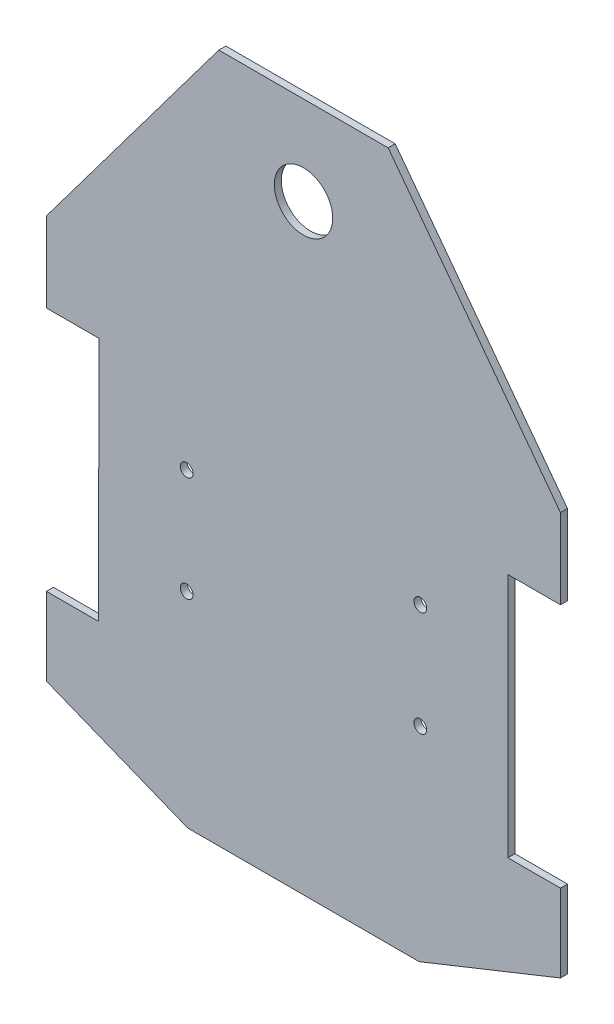
ISO-10303-21;
HEADER;
FILE_DESCRIPTION(('STEP AP214'),'2;1');
FILE_NAME('part.step','',(''),(''),'','','');
FILE_SCHEMA(('AUTOMOTIVE_DESIGN { 1 0 10303 214 1 1 1 1 }'));
ENDSEC;
DATA;
#1=APPLICATION_CONTEXT('core data for automotive mechanical design processes');
#2=APPLICATION_PROTOCOL_DEFINITION('international standard','automotive_design',2000,#1);
#3=PRODUCT_CONTEXT('',#1,'mechanical');
#4=PRODUCT('Part','Part','',(#3));
#5=PRODUCT_RELATED_PRODUCT_CATEGORY('part','',(#4));
#6=PRODUCT_DEFINITION_FORMATION('','',#4);
#7=PRODUCT_DEFINITION_CONTEXT('part definition',#1,'design');
#8=PRODUCT_DEFINITION('design','',#6,#7);
#9=PRODUCT_DEFINITION_SHAPE('','',#8);
#10=(LENGTH_UNIT() NAMED_UNIT(*) SI_UNIT(.MILLI.,.METRE.));
#11=(NAMED_UNIT(*) PLANE_ANGLE_UNIT() SI_UNIT($,.RADIAN.));
#12=(NAMED_UNIT(*) SI_UNIT($,.STERADIAN.) SOLID_ANGLE_UNIT());
#13=UNCERTAINTY_MEASURE_WITH_UNIT(LENGTH_MEASURE(1.E-05),#10,'distance_accuracy_value','');
#14=(GEOMETRIC_REPRESENTATION_CONTEXT(3) GLOBAL_UNCERTAINTY_ASSIGNED_CONTEXT((#13)) GLOBAL_UNIT_ASSIGNED_CONTEXT((#10,
#11,#12)) REPRESENTATION_CONTEXT('',''));
#15=CARTESIAN_POINT('',(0.,0.,0.));
#16=DIRECTION('',(0.,0.,1.));
#17=DIRECTION('',(1.,0.,0.));
#18=AXIS2_PLACEMENT_3D('',#15,#16,#17);
#19=CARTESIAN_POINT('',(0.,0.,1.2));
#20=DIRECTION('',(0.,0.,-1.));
#21=DIRECTION('',(-1.,0.,0.));
#22=AXIS2_PLACEMENT_3D('',#19,#20,#21);
#23=PLANE('',#22);
#24=CARTESIAN_POINT('',(0.,43.8089115427591,1.2));
#25=DIRECTION('',(0.,0.,1.));
#26=DIRECTION('',(1.,0.,0.));
#27=AXIS2_PLACEMENT_3D('',#24,#25,#26);
#28=CIRCLE('',#27,5.);
#29=CARTESIAN_POINT('',(5.,43.8089115427591,1.2));
#30=VERTEX_POINT('',#29);
#31=EDGE_CURVE('E344',#30,#30,#28,.T.);
#32=ORIENTED_EDGE('',*,*,#31,.F.);
#33=EDGE_LOOP('',(#32));
#34=FACE_BOUND('',#33,.T.);
#35=DIRECTION('',(1.,0.,0.));
#36=VECTOR('',#35,1.);
#37=CARTESIAN_POINT('',(19.8074175964328,-59.,1.2));
#38=LINE('',#37,#36);
#39=CARTESIAN_POINT('',(-19.8074175964328,-59.,1.2));
#40=VERTEX_POINT('',#39);
#41=CARTESIAN_POINT('',(19.8074175964328,-59.,1.2));
#42=VERTEX_POINT('',#41);
#43=EDGE_CURVE('E213',#40,#42,#38,.T.);
#44=ORIENTED_EDGE('',*,*,#43,.T.);
#45=DIRECTION('',(0.92847669088526,0.371390676354104,0.));
#46=VECTOR('',#45,1.);
#47=CARTESIAN_POINT('',(44.,-49.3229670385731,1.2));
#48=LINE('',#47,#46);
#49=CARTESIAN_POINT('',(44.,-49.3229670385731,1.2));
#50=VERTEX_POINT('',#49);
#51=EDGE_CURVE('E121',#42,#50,#48,.T.);
#52=ORIENTED_EDGE('',*,*,#51,.T.);
#53=DIRECTION('',(0.,1.,0.));
#54=VECTOR('',#53,1.);
#55=CARTESIAN_POINT('',(44.,-36.,1.2));
#56=LINE('',#55,#54);
#57=CARTESIAN_POINT('',(44.,-36.,1.2));
#58=VERTEX_POINT('',#57);
#59=EDGE_CURVE('E252',#50,#58,#56,.T.);
#60=ORIENTED_EDGE('',*,*,#59,.T.);
#61=DIRECTION('',(-1.,0.,0.));
#62=VECTOR('',#61,1.);
#63=CARTESIAN_POINT('',(35.,-36.,1.2));
#64=LINE('',#63,#62);
#65=CARTESIAN_POINT('',(35.,-36.,1.2));
#66=VERTEX_POINT('',#65);
#67=EDGE_CURVE('E271',#58,#66,#64,.T.);
#68=ORIENTED_EDGE('',*,*,#67,.T.);
#69=DIRECTION('',(0.,1.,0.));
#70=VECTOR('',#69,1.);
#71=CARTESIAN_POINT('',(35.,6.,1.2));
#72=LINE('',#71,#70);
#73=CARTESIAN_POINT('',(35.,6.,1.2));
#74=VERTEX_POINT('',#73);
#75=EDGE_CURVE('E268',#66,#74,#72,.T.);
#76=ORIENTED_EDGE('',*,*,#75,.T.);
#77=DIRECTION('',(1.,0.,0.));
#78=VECTOR('',#77,1.);
#79=CARTESIAN_POINT('',(44.,6.,1.2));
#80=LINE('',#79,#78);
#81=CARTESIAN_POINT('',(44.,6.,1.2));
#82=VERTEX_POINT('',#81);
#83=EDGE_CURVE('E270',#74,#82,#80,.T.);
#84=ORIENTED_EDGE('',*,*,#83,.T.);
#85=DIRECTION('',(0.,1.,0.));
#86=VECTOR('',#85,1.);
#87=CARTESIAN_POINT('',(44.,19.6666666666667,1.2));
#88=LINE('',#87,#86);
#89=CARTESIAN_POINT('',(44.,19.6666666666667,1.2));
#90=VERTEX_POINT('',#89);
#91=EDGE_CURVE('E273',#82,#90,#88,.T.);
#92=ORIENTED_EDGE('',*,*,#91,.T.);
#93=DIRECTION('',(-0.6,0.8,0.));
#94=VECTOR('',#93,1.);
#95=CARTESIAN_POINT('',(14.5,59.,1.2));
#96=LINE('',#95,#94);
#97=CARTESIAN_POINT('',(14.5,59.,1.2));
#98=VERTEX_POINT('',#97);
#99=EDGE_CURVE('E279',#90,#98,#96,.T.);
#100=ORIENTED_EDGE('',*,*,#99,.T.);
#101=DIRECTION('',(-1.,0.,0.));
#102=VECTOR('',#101,1.);
#103=CARTESIAN_POINT('',(-14.5,59.,1.2));
#104=LINE('',#103,#102);
#105=CARTESIAN_POINT('',(-14.5,59.,1.2));
#106=VERTEX_POINT('',#105);
#107=EDGE_CURVE('E281',#98,#106,#104,.T.);
#108=ORIENTED_EDGE('',*,*,#107,.T.);
#109=DIRECTION('',(-0.6,-0.8,0.));
#110=VECTOR('',#109,1.);
#111=CARTESIAN_POINT('',(-44.,19.6666666666667,1.2));
#112=LINE('',#111,#110);
#113=CARTESIAN_POINT('',(-44.,19.6666666666667,1.2));
#114=VERTEX_POINT('',#113);
#115=EDGE_CURVE('E283',#106,#114,#112,.T.);
#116=ORIENTED_EDGE('',*,*,#115,.T.);
#117=DIRECTION('',(0.,-1.,0.));
#118=VECTOR('',#117,1.);
#119=CARTESIAN_POINT('',(-44.,6.,1.2));
#120=LINE('',#119,#118);
#121=CARTESIAN_POINT('',(-44.,6.,1.2));
#122=VERTEX_POINT('',#121);
#123=EDGE_CURVE('E285',#114,#122,#120,.T.);
#124=ORIENTED_EDGE('',*,*,#123,.T.);
#125=DIRECTION('',(1.,0.,0.));
#126=VECTOR('',#125,1.);
#127=CARTESIAN_POINT('',(-35.,6.,1.2));
#128=LINE('',#127,#126);
#129=CARTESIAN_POINT('',(-35.,6.,1.2));
#130=VERTEX_POINT('',#129);
#131=EDGE_CURVE('E287',#122,#130,#128,.T.);
#132=ORIENTED_EDGE('',*,*,#131,.T.);
#133=DIRECTION('',(-0.00261649095802277,-0.999996576981675,0.));
#134=VECTOR('',#133,1.);
#135=CARTESIAN_POINT('',(-35.1098929964027,-36.,1.2));
#136=LINE('',#135,#134);
#137=CARTESIAN_POINT('',(-35.1098929964027,-36.,1.2));
#138=VERTEX_POINT('',#137);
#139=EDGE_CURVE('E164',#130,#138,#136,.T.);
#140=ORIENTED_EDGE('',*,*,#139,.T.);
#141=DIRECTION('',(-1.,0.,0.));
#142=VECTOR('',#141,1.);
#143=CARTESIAN_POINT('',(-44.,-36.,1.2));
#144=LINE('',#143,#142);
#145=CARTESIAN_POINT('',(-44.,-36.,1.2));
#146=VERTEX_POINT('',#145);
#147=EDGE_CURVE('E158',#138,#146,#144,.T.);
#148=ORIENTED_EDGE('',*,*,#147,.T.);
#149=DIRECTION('',(0.,-1.,0.));
#150=VECTOR('',#149,1.);
#151=CARTESIAN_POINT('',(-44.,-49.3229670385731,1.2));
#152=LINE('',#151,#150);
#153=CARTESIAN_POINT('',(-44.,-49.3229670385731,1.2));
#154=VERTEX_POINT('',#153);
#155=EDGE_CURVE('E162',#146,#154,#152,.T.);
#156=ORIENTED_EDGE('',*,*,#155,.T.);
#157=DIRECTION('',(0.92847669088526,-0.371390676354104,0.));
#158=VECTOR('',#157,1.);
#159=CARTESIAN_POINT('',(-19.8074175964328,-59.,1.2));
#160=LINE('',#159,#158);
#161=EDGE_CURVE('E54',#154,#40,#160,.T.);
#162=ORIENTED_EDGE('',*,*,#161,.T.);
#163=EDGE_LOOP('',(#44,#52,#60,#68,#76,#84,#92,#100,#108,#116,#124,#132,#140,#148,#156,#162));
#164=FACE_BOUND('',#163,.T.);
#165=CARTESIAN_POINT('',(-20.,-6.00000000000009,1.2));
#166=DIRECTION('',(0.,0.,1.));
#167=DIRECTION('',(1.,0.,0.));
#168=AXIS2_PLACEMENT_3D('',#165,#166,#167);
#169=CIRCLE('',#168,1.1);
#170=CARTESIAN_POINT('',(-18.9,-6.00000000000009,1.2));
#171=VERTEX_POINT('',#170);
#172=EDGE_CURVE('E186',#171,#171,#169,.T.);
#173=ORIENTED_EDGE('',*,*,#172,.F.);
#174=EDGE_LOOP('',(#173));
#175=FACE_BOUND('',#174,.T.);
#176=CARTESIAN_POINT('',(-20.,-24.0000000000001,1.2));
#177=DIRECTION('',(0.,0.,1.));
#178=DIRECTION('',(1.,0.,0.));
#179=AXIS2_PLACEMENT_3D('',#176,#177,#178);
#180=CIRCLE('',#179,1.1);
#181=CARTESIAN_POINT('',(-18.9,-24.0000000000001,1.2));
#182=VERTEX_POINT('',#181);
#183=EDGE_CURVE('E361',#182,#182,#180,.T.);
#184=ORIENTED_EDGE('',*,*,#183,.F.);
#185=EDGE_LOOP('',(#184));
#186=FACE_BOUND('',#185,.T.);
#187=CARTESIAN_POINT('',(20.,-6.00000000000009,1.2));
#188=DIRECTION('',(0.,0.,1.));
#189=DIRECTION('',(1.,0.,0.));
#190=AXIS2_PLACEMENT_3D('',#187,#188,#189);
#191=CIRCLE('',#190,1.1);
#192=CARTESIAN_POINT('',(21.1,-6.00000000000009,1.2));
#193=VERTEX_POINT('',#192);
#194=EDGE_CURVE('E355',#193,#193,#191,.T.);
#195=ORIENTED_EDGE('',*,*,#194,.F.);
#196=EDGE_LOOP('',(#195));
#197=FACE_BOUND('',#196,.T.);
#198=CARTESIAN_POINT('',(20.,-24.0000000000001,1.2));
#199=DIRECTION('',(0.,0.,1.));
#200=DIRECTION('',(1.,0.,0.));
#201=AXIS2_PLACEMENT_3D('',#198,#199,#200);
#202=CIRCLE('',#201,1.1);
#203=CARTESIAN_POINT('',(21.1,-24.0000000000001,1.2));
#204=VERTEX_POINT('',#203);
#205=EDGE_CURVE('E349',#204,#204,#202,.T.);
#206=ORIENTED_EDGE('',*,*,#205,.F.);
#207=EDGE_LOOP('',(#206));
#208=FACE_BOUND('',#207,.T.);
#209=ADVANCED_FACE('F37',(#34,#164,#175,#186,#197,#208),#23,.F.);
#210=CARTESIAN_POINT('',(0.,0.,0.));
#211=DIRECTION('',(0.,0.,-1.));
#212=DIRECTION('',(-1.,0.,0.));
#213=AXIS2_PLACEMENT_3D('',#210,#211,#212);
#214=PLANE('',#213);
#215=CARTESIAN_POINT('',(0.,43.8089115427591,0.));
#216=DIRECTION('',(0.,0.,1.));
#217=DIRECTION('',(1.,0.,0.));
#218=AXIS2_PLACEMENT_3D('',#215,#216,#217);
#219=CIRCLE('',#218,5.);
#220=CARTESIAN_POINT('',(5.,43.8089115427591,0.));
#221=VERTEX_POINT('',#220);
#222=EDGE_CURVE('E342',#221,#221,#219,.T.);
#223=ORIENTED_EDGE('',*,*,#222,.T.);
#224=EDGE_LOOP('',(#223));
#225=FACE_BOUND('',#224,.T.);
#226=CARTESIAN_POINT('',(20.,-6.00000000000009,0.));
#227=DIRECTION('',(0.,0.,1.));
#228=DIRECTION('',(1.,0.,0.));
#229=AXIS2_PLACEMENT_3D('',#226,#227,#228);
#230=CIRCLE('',#229,1.1);
#231=CARTESIAN_POINT('',(21.1,-6.00000000000009,0.));
#232=VERTEX_POINT('',#231);
#233=EDGE_CURVE('E352',#232,#232,#230,.T.);
#234=ORIENTED_EDGE('',*,*,#233,.T.);
#235=EDGE_LOOP('',(#234));
#236=FACE_BOUND('',#235,.T.);
#237=CARTESIAN_POINT('',(-20.,-6.00000000000009,0.));
#238=DIRECTION('',(0.,0.,1.));
#239=DIRECTION('',(1.,0.,0.));
#240=AXIS2_PLACEMENT_3D('',#237,#238,#239);
#241=CIRCLE('',#240,1.1);
#242=CARTESIAN_POINT('',(-18.9,-6.00000000000009,0.));
#243=VERTEX_POINT('',#242);
#244=EDGE_CURVE('E364',#243,#243,#241,.T.);
#245=ORIENTED_EDGE('',*,*,#244,.T.);
#246=EDGE_LOOP('',(#245));
#247=FACE_BOUND('',#246,.T.);
#248=DIRECTION('',(1.,0.,0.));
#249=VECTOR('',#248,1.);
#250=CARTESIAN_POINT('',(19.8074175964328,-59.,0.));
#251=LINE('',#250,#249);
#252=CARTESIAN_POINT('',(-19.8074175964328,-59.,0.));
#253=VERTEX_POINT('',#252);
#254=CARTESIAN_POINT('',(19.8074175964328,-59.,0.));
#255=VERTEX_POINT('',#254);
#256=EDGE_CURVE('E182',#253,#255,#251,.T.);
#257=ORIENTED_EDGE('',*,*,#256,.F.);
#258=DIRECTION('',(0.92847669088526,-0.371390676354104,0.));
#259=VECTOR('',#258,1.);
#260=CARTESIAN_POINT('',(-19.8074175964328,-59.,0.));
#261=LINE('',#260,#259);
#262=CARTESIAN_POINT('',(-44.,-49.3229670385731,0.));
#263=VERTEX_POINT('',#262);
#264=EDGE_CURVE('E113',#263,#253,#261,.T.);
#265=ORIENTED_EDGE('',*,*,#264,.F.);
#266=DIRECTION('',(0.,-1.,0.));
#267=VECTOR('',#266,1.);
#268=CARTESIAN_POINT('',(-44.,-49.3229670385731,0.));
#269=LINE('',#268,#267);
#270=CARTESIAN_POINT('',(-44.,-36.,0.));
#271=VERTEX_POINT('',#270);
#272=EDGE_CURVE('E107',#271,#263,#269,.T.);
#273=ORIENTED_EDGE('',*,*,#272,.F.);
#274=DIRECTION('',(-1.,0.,0.));
#275=VECTOR('',#274,1.);
#276=CARTESIAN_POINT('',(-44.,-36.,0.));
#277=LINE('',#276,#275);
#278=CARTESIAN_POINT('',(-35.1098929964027,-36.,0.));
#279=VERTEX_POINT('',#278);
#280=EDGE_CURVE('E172',#279,#271,#277,.T.);
#281=ORIENTED_EDGE('',*,*,#280,.F.);
#282=DIRECTION('',(-0.00261649095802277,-0.999996576981675,0.));
#283=VECTOR('',#282,1.);
#284=CARTESIAN_POINT('',(-35.1098929964027,-36.,0.));
#285=LINE('',#284,#283);
#286=CARTESIAN_POINT('',(-35.,6.,0.));
#287=VERTEX_POINT('',#286);
#288=EDGE_CURVE('E208',#287,#279,#285,.T.);
#289=ORIENTED_EDGE('',*,*,#288,.F.);
#290=DIRECTION('',(1.,0.,0.));
#291=VECTOR('',#290,1.);
#292=CARTESIAN_POINT('',(-35.,6.,0.));
#293=LINE('',#292,#291);
#294=CARTESIAN_POINT('',(-44.,6.,0.));
#295=VERTEX_POINT('',#294);
#296=EDGE_CURVE('E206',#295,#287,#293,.T.);
#297=ORIENTED_EDGE('',*,*,#296,.F.);
#298=DIRECTION('',(0.,-1.,0.));
#299=VECTOR('',#298,1.);
#300=CARTESIAN_POINT('',(-44.,6.,0.));
#301=LINE('',#300,#299);
#302=CARTESIAN_POINT('',(-44.,19.6666666666667,0.));
#303=VERTEX_POINT('',#302);
#304=EDGE_CURVE('E204',#303,#295,#301,.T.);
#305=ORIENTED_EDGE('',*,*,#304,.F.);
#306=DIRECTION('',(-0.6,-0.8,0.));
#307=VECTOR('',#306,1.);
#308=CARTESIAN_POINT('',(-44.,19.6666666666667,0.));
#309=LINE('',#308,#307);
#310=CARTESIAN_POINT('',(-14.5,59.,0.));
#311=VERTEX_POINT('',#310);
#312=EDGE_CURVE('E202',#311,#303,#309,.T.);
#313=ORIENTED_EDGE('',*,*,#312,.F.);
#314=DIRECTION('',(-1.,0.,0.));
#315=VECTOR('',#314,1.);
#316=CARTESIAN_POINT('',(-14.5,59.,0.));
#317=LINE('',#316,#315);
#318=CARTESIAN_POINT('',(14.5,59.,0.));
#319=VERTEX_POINT('',#318);
#320=EDGE_CURVE('E200',#319,#311,#317,.T.);
#321=ORIENTED_EDGE('',*,*,#320,.F.);
#322=DIRECTION('',(-0.6,0.8,0.));
#323=VECTOR('',#322,1.);
#324=CARTESIAN_POINT('',(14.5,59.,0.));
#325=LINE('',#324,#323);
#326=CARTESIAN_POINT('',(44.,19.6666666666667,0.));
#327=VERTEX_POINT('',#326);
#328=EDGE_CURVE('E198',#327,#319,#325,.T.);
#329=ORIENTED_EDGE('',*,*,#328,.F.);
#330=DIRECTION('',(0.,1.,0.));
#331=VECTOR('',#330,1.);
#332=CARTESIAN_POINT('',(44.,19.6666666666667,0.));
#333=LINE('',#332,#331);
#334=CARTESIAN_POINT('',(44.,6.,0.));
#335=VERTEX_POINT('',#334);
#336=EDGE_CURVE('E196',#335,#327,#333,.T.);
#337=ORIENTED_EDGE('',*,*,#336,.F.);
#338=DIRECTION('',(1.,0.,0.));
#339=VECTOR('',#338,1.);
#340=CARTESIAN_POINT('',(44.,6.,0.));
#341=LINE('',#340,#339);
#342=CARTESIAN_POINT('',(35.,6.,0.));
#343=VERTEX_POINT('',#342);
#344=EDGE_CURVE('E194',#343,#335,#341,.T.);
#345=ORIENTED_EDGE('',*,*,#344,.F.);
#346=DIRECTION('',(0.,1.,0.));
#347=VECTOR('',#346,1.);
#348=CARTESIAN_POINT('',(35.,6.,0.));
#349=LINE('',#348,#347);
#350=CARTESIAN_POINT('',(35.,-36.,0.));
#351=VERTEX_POINT('',#350);
#352=EDGE_CURVE('E192',#351,#343,#349,.T.);
#353=ORIENTED_EDGE('',*,*,#352,.F.);
#354=DIRECTION('',(-1.,0.,0.));
#355=VECTOR('',#354,1.);
#356=CARTESIAN_POINT('',(35.,-36.,0.));
#357=LINE('',#356,#355);
#358=CARTESIAN_POINT('',(44.,-36.,0.));
#359=VERTEX_POINT('',#358);
#360=EDGE_CURVE('E190',#359,#351,#357,.T.);
#361=ORIENTED_EDGE('',*,*,#360,.F.);
#362=DIRECTION('',(0.,1.,0.));
#363=VECTOR('',#362,1.);
#364=CARTESIAN_POINT('',(44.,-36.,0.));
#365=LINE('',#364,#363);
#366=CARTESIAN_POINT('',(44.,-49.3229670385731,0.));
#367=VERTEX_POINT('',#366);
#368=EDGE_CURVE('E188',#367,#359,#365,.T.);
#369=ORIENTED_EDGE('',*,*,#368,.F.);
#370=DIRECTION('',(0.92847669088526,0.371390676354104,0.));
#371=VECTOR('',#370,1.);
#372=CARTESIAN_POINT('',(44.,-49.3229670385731,0.));
#373=LINE('',#372,#371);
#374=EDGE_CURVE('E185',#255,#367,#373,.T.);
#375=ORIENTED_EDGE('',*,*,#374,.F.);
#376=EDGE_LOOP('',(#257,#265,#273,#281,#289,#297,#305,#313,#321,#329,#337,#345,#353,#361,#369,#375));
#377=FACE_BOUND('',#376,.T.);
#378=CARTESIAN_POINT('',(-20.,-24.0000000000001,0.));
#379=DIRECTION('',(0.,0.,1.));
#380=DIRECTION('',(1.,0.,0.));
#381=AXIS2_PLACEMENT_3D('',#378,#379,#380);
#382=CIRCLE('',#381,1.1);
#383=CARTESIAN_POINT('',(-18.9,-24.0000000000001,0.));
#384=VERTEX_POINT('',#383);
#385=EDGE_CURVE('E358',#384,#384,#382,.T.);
#386=ORIENTED_EDGE('',*,*,#385,.T.);
#387=EDGE_LOOP('',(#386));
#388=FACE_BOUND('',#387,.T.);
#389=CARTESIAN_POINT('',(20.,-24.0000000000001,0.));
#390=DIRECTION('',(0.,0.,1.));
#391=DIRECTION('',(1.,0.,0.));
#392=AXIS2_PLACEMENT_3D('',#389,#390,#391);
#393=CIRCLE('',#392,1.1);
#394=CARTESIAN_POINT('',(21.1,-24.0000000000001,0.));
#395=VERTEX_POINT('',#394);
#396=EDGE_CURVE('E346',#395,#395,#393,.T.);
#397=ORIENTED_EDGE('',*,*,#396,.T.);
#398=EDGE_LOOP('',(#397));
#399=FACE_BOUND('',#398,.T.);
#400=ADVANCED_FACE('F256',(#225,#236,#247,#377,#388,#399),#214,.T.);
#401=CARTESIAN_POINT('',(19.8074175964328,-59.,1.2));
#402=DIRECTION('',(0.,1.,0.));
#403=DIRECTION('',(0.,0.,1.));
#404=AXIS2_PLACEMENT_3D('',#401,#402,#403);
#405=PLANE('',#404);
#406=ORIENTED_EDGE('',*,*,#256,.T.);
#407=DIRECTION('',(0.,0.,-1.));
#408=VECTOR('',#407,1.);
#409=CARTESIAN_POINT('',(19.8074175964328,-59.,1.2));
#410=LINE('',#409,#408);
#411=EDGE_CURVE('E11',#42,#255,#410,.T.);
#412=ORIENTED_EDGE('',*,*,#411,.F.);
#413=ORIENTED_EDGE('',*,*,#43,.F.);
#414=DIRECTION('',(0.,0.,-1.));
#415=VECTOR('',#414,1.);
#416=CARTESIAN_POINT('',(-19.8074175964328,-59.,1.2));
#417=LINE('',#416,#415);
#418=EDGE_CURVE('E178',#40,#253,#417,.T.);
#419=ORIENTED_EDGE('',*,*,#418,.T.);
#420=EDGE_LOOP('',(#406,#412,#413,#419));
#421=FACE_BOUND('',#420,.T.);
#422=ADVANCED_FACE('F39',(#421),#405,.F.);
#423=CARTESIAN_POINT('',(44.,-49.3229670385731,1.2));
#424=DIRECTION('',(-0.371390676354104,0.928476690885259,0.));
#425=DIRECTION('',(-0.928476690885259,-0.371390676354104,0.));
#426=AXIS2_PLACEMENT_3D('',#423,#424,#425);
#427=PLANE('',#426);
#428=ORIENTED_EDGE('',*,*,#374,.T.);
#429=DIRECTION('',(0.,0.,-1.));
#430=VECTOR('',#429,1.);
#431=CARTESIAN_POINT('',(44.,-49.3229670385731,1.2));
#432=LINE('',#431,#430);
#433=EDGE_CURVE('E46',#50,#367,#432,.T.);
#434=ORIENTED_EDGE('',*,*,#433,.F.);
#435=ORIENTED_EDGE('',*,*,#51,.F.);
#436=ORIENTED_EDGE('',*,*,#411,.T.);
#437=EDGE_LOOP('',(#428,#434,#435,#436));
#438=FACE_BOUND('',#437,.T.);
#439=ADVANCED_FACE('F540',(#438),#427,.F.);
#440=CARTESIAN_POINT('',(44.,-36.,1.2));
#441=DIRECTION('',(-1.,0.,0.));
#442=DIRECTION('',(0.,0.,1.));
#443=AXIS2_PLACEMENT_3D('',#440,#441,#442);
#444=PLANE('',#443);
#445=ORIENTED_EDGE('',*,*,#368,.T.);
#446=DIRECTION('',(0.,0.,-1.));
#447=VECTOR('',#446,1.);
#448=CARTESIAN_POINT('',(44.,-36.,1.2));
#449=LINE('',#448,#447);
#450=EDGE_CURVE('E244',#58,#359,#449,.T.);
#451=ORIENTED_EDGE('',*,*,#450,.F.);
#452=ORIENTED_EDGE('',*,*,#59,.F.);
#453=ORIENTED_EDGE('',*,*,#433,.T.);
#454=EDGE_LOOP('',(#445,#451,#452,#453));
#455=FACE_BOUND('',#454,.T.);
#456=ADVANCED_FACE('F250',(#455),#444,.F.);
#457=CARTESIAN_POINT('',(35.,-36.,1.2));
#458=DIRECTION('',(0.,-1.,0.));
#459=DIRECTION('',(0.,0.,-1.));
#460=AXIS2_PLACEMENT_3D('',#457,#458,#459);
#461=PLANE('',#460);
#462=ORIENTED_EDGE('',*,*,#360,.T.);
#463=DIRECTION('',(0.,0.,-1.));
#464=VECTOR('',#463,1.);
#465=CARTESIAN_POINT('',(35.,-36.,1.2));
#466=LINE('',#465,#464);
#467=EDGE_CURVE('E241',#66,#351,#466,.T.);
#468=ORIENTED_EDGE('',*,*,#467,.F.);
#469=ORIENTED_EDGE('',*,*,#67,.F.);
#470=ORIENTED_EDGE('',*,*,#450,.T.);
#471=EDGE_LOOP('',(#462,#468,#469,#470));
#472=FACE_BOUND('',#471,.T.);
#473=ADVANCED_FACE('F262',(#472),#461,.F.);
#474=CARTESIAN_POINT('',(35.,6.,1.2));
#475=DIRECTION('',(-1.,0.,0.));
#476=DIRECTION('',(0.,0.,1.));
#477=AXIS2_PLACEMENT_3D('',#474,#475,#476);
#478=PLANE('',#477);
#479=ORIENTED_EDGE('',*,*,#352,.T.);
#480=DIRECTION('',(0.,0.,-1.));
#481=VECTOR('',#480,1.);
#482=CARTESIAN_POINT('',(35.,6.,1.2));
#483=LINE('',#482,#481);
#484=EDGE_CURVE('E238',#74,#343,#483,.T.);
#485=ORIENTED_EDGE('',*,*,#484,.F.);
#486=ORIENTED_EDGE('',*,*,#75,.F.);
#487=ORIENTED_EDGE('',*,*,#467,.T.);
#488=EDGE_LOOP('',(#479,#485,#486,#487));
#489=FACE_BOUND('',#488,.T.);
#490=ADVANCED_FACE('F266',(#489),#478,.F.);
#491=CARTESIAN_POINT('',(44.,6.,1.2));
#492=DIRECTION('',(0.,1.,0.));
#493=DIRECTION('',(-1.,0.,0.));
#494=AXIS2_PLACEMENT_3D('',#491,#492,#493);
#495=PLANE('',#494);
#496=ORIENTED_EDGE('',*,*,#344,.T.);
#497=DIRECTION('',(0.,0.,-1.));
#498=VECTOR('',#497,1.);
#499=CARTESIAN_POINT('',(44.,6.,1.2));
#500=LINE('',#499,#498);
#501=EDGE_CURVE('E235',#82,#335,#500,.T.);
#502=ORIENTED_EDGE('',*,*,#501,.F.);
#503=ORIENTED_EDGE('',*,*,#83,.F.);
#504=ORIENTED_EDGE('',*,*,#484,.T.);
#505=EDGE_LOOP('',(#496,#502,#503,#504));
#506=FACE_BOUND('',#505,.T.);
#507=ADVANCED_FACE('F501',(#506),#495,.F.);
#508=CARTESIAN_POINT('',(44.,19.6666666666667,1.2));
#509=DIRECTION('',(-1.,0.,0.));
#510=DIRECTION('',(0.,0.,1.));
#511=AXIS2_PLACEMENT_3D('',#508,#509,#510);
#512=PLANE('',#511);
#513=ORIENTED_EDGE('',*,*,#336,.T.);
#514=DIRECTION('',(0.,0.,-1.));
#515=VECTOR('',#514,1.);
#516=CARTESIAN_POINT('',(44.,19.6666666666667,1.2));
#517=LINE('',#516,#515);
#518=EDGE_CURVE('E232',#90,#327,#517,.T.);
#519=ORIENTED_EDGE('',*,*,#518,.F.);
#520=ORIENTED_EDGE('',*,*,#91,.F.);
#521=ORIENTED_EDGE('',*,*,#501,.T.);
#522=EDGE_LOOP('',(#513,#519,#520,#521));
#523=FACE_BOUND('',#522,.T.);
#524=ADVANCED_FACE('F490',(#523),#512,.F.);
#525=CARTESIAN_POINT('',(14.5,59.,1.2));
#526=DIRECTION('',(-0.8,-0.6,0.));
#527=DIRECTION('',(0.6,-0.8,0.));
#528=AXIS2_PLACEMENT_3D('',#525,#526,#527);
#529=PLANE('',#528);
#530=ORIENTED_EDGE('',*,*,#328,.T.);
#531=DIRECTION('',(0.,0.,-1.));
#532=VECTOR('',#531,1.);
#533=CARTESIAN_POINT('',(14.5,59.,1.2));
#534=LINE('',#533,#532);
#535=EDGE_CURVE('E229',#98,#319,#534,.T.);
#536=ORIENTED_EDGE('',*,*,#535,.F.);
#537=ORIENTED_EDGE('',*,*,#99,.F.);
#538=ORIENTED_EDGE('',*,*,#518,.T.);
#539=EDGE_LOOP('',(#530,#536,#537,#538));
#540=FACE_BOUND('',#539,.T.);
#541=ADVANCED_FACE('F479',(#540),#529,.F.);
#542=CARTESIAN_POINT('',(-14.5,59.,1.2));
#543=DIRECTION('',(0.,-1.,0.));
#544=DIRECTION('',(0.,0.,-1.));
#545=AXIS2_PLACEMENT_3D('',#542,#543,#544);
#546=PLANE('',#545);
#547=ORIENTED_EDGE('',*,*,#320,.T.);
#548=DIRECTION('',(0.,0.,-1.));
#549=VECTOR('',#548,1.);
#550=CARTESIAN_POINT('',(-14.5,59.,1.2));
#551=LINE('',#550,#549);
#552=EDGE_CURVE('E226',#106,#311,#551,.T.);
#553=ORIENTED_EDGE('',*,*,#552,.F.);
#554=ORIENTED_EDGE('',*,*,#107,.F.);
#555=ORIENTED_EDGE('',*,*,#535,.T.);
#556=EDGE_LOOP('',(#547,#553,#554,#555));
#557=FACE_BOUND('',#556,.T.);
#558=ADVANCED_FACE('F468',(#557),#546,.F.);
#559=CARTESIAN_POINT('',(-44.,19.6666666666667,1.2));
#560=DIRECTION('',(0.8,-0.6,0.));
#561=DIRECTION('',(0.6,0.8,0.));
#562=AXIS2_PLACEMENT_3D('',#559,#560,#561);
#563=PLANE('',#562);
#564=ORIENTED_EDGE('',*,*,#312,.T.);
#565=DIRECTION('',(0.,0.,-1.));
#566=VECTOR('',#565,1.);
#567=CARTESIAN_POINT('',(-44.,19.6666666666667,1.2));
#568=LINE('',#567,#566);
#569=EDGE_CURVE('E223',#114,#303,#568,.T.);
#570=ORIENTED_EDGE('',*,*,#569,.F.);
#571=ORIENTED_EDGE('',*,*,#115,.F.);
#572=ORIENTED_EDGE('',*,*,#552,.T.);
#573=EDGE_LOOP('',(#564,#570,#571,#572));
#574=FACE_BOUND('',#573,.T.);
#575=ADVANCED_FACE('F457',(#574),#563,.F.);
#576=CARTESIAN_POINT('',(-44.,6.,1.2));
#577=DIRECTION('',(1.,0.,0.));
#578=DIRECTION('',(0.,0.,-1.));
#579=AXIS2_PLACEMENT_3D('',#576,#577,#578);
#580=PLANE('',#579);
#581=ORIENTED_EDGE('',*,*,#304,.T.);
#582=DIRECTION('',(0.,0.,-1.));
#583=VECTOR('',#582,1.);
#584=CARTESIAN_POINT('',(-44.,6.,1.2));
#585=LINE('',#584,#583);
#586=EDGE_CURVE('E220',#122,#295,#585,.T.);
#587=ORIENTED_EDGE('',*,*,#586,.F.);
#588=ORIENTED_EDGE('',*,*,#123,.F.);
#589=ORIENTED_EDGE('',*,*,#569,.T.);
#590=EDGE_LOOP('',(#581,#587,#588,#589));
#591=FACE_BOUND('',#590,.T.);
#592=ADVANCED_FACE('F447',(#591),#580,.F.);
#593=CARTESIAN_POINT('',(-35.,6.,1.2));
#594=DIRECTION('',(0.,1.,0.));
#595=DIRECTION('',(-1.,0.,0.));
#596=AXIS2_PLACEMENT_3D('',#593,#594,#595);
#597=PLANE('',#596);
#598=ORIENTED_EDGE('',*,*,#296,.T.);
#599=DIRECTION('',(0.,0.,-1.));
#600=VECTOR('',#599,1.);
#601=CARTESIAN_POINT('',(-35.,6.,1.2));
#602=LINE('',#601,#600);
#603=EDGE_CURVE('E217',#130,#287,#602,.T.);
#604=ORIENTED_EDGE('',*,*,#603,.F.);
#605=ORIENTED_EDGE('',*,*,#131,.F.);
#606=ORIENTED_EDGE('',*,*,#586,.T.);
#607=EDGE_LOOP('',(#598,#604,#605,#606));
#608=FACE_BOUND('',#607,.T.);
#609=ADVANCED_FACE('F293',(#608),#597,.F.);
#610=CARTESIAN_POINT('',(-35.1098929964027,-36.,1.2));
#611=DIRECTION('',(0.999996576981675,-0.00261649095802277,0.));
#612=DIRECTION('',(0.00261649095802277,0.999996576981675,0.));
#613=AXIS2_PLACEMENT_3D('',#610,#611,#612);
#614=PLANE('',#613);
#615=ORIENTED_EDGE('',*,*,#288,.T.);
#616=DIRECTION('',(0.,0.,-1.));
#617=VECTOR('',#616,1.);
#618=CARTESIAN_POINT('',(-35.1098929964027,-36.,1.2));
#619=LINE('',#618,#617);
#620=EDGE_CURVE('E173',#138,#279,#619,.T.);
#621=ORIENTED_EDGE('',*,*,#620,.F.);
#622=ORIENTED_EDGE('',*,*,#139,.F.);
#623=ORIENTED_EDGE('',*,*,#603,.T.);
#624=EDGE_LOOP('',(#615,#621,#622,#623));
#625=FACE_BOUND('',#624,.T.);
#626=ADVANCED_FACE('F297',(#625),#614,.F.);
#627=CARTESIAN_POINT('',(-44.,-36.,1.2));
#628=DIRECTION('',(0.,-1.,0.));
#629=DIRECTION('',(0.,0.,-1.));
#630=AXIS2_PLACEMENT_3D('',#627,#628,#629);
#631=PLANE('',#630);
#632=ORIENTED_EDGE('',*,*,#280,.T.);
#633=DIRECTION('',(0.,0.,-1.));
#634=VECTOR('',#633,1.);
#635=CARTESIAN_POINT('',(-44.,-36.,1.2));
#636=LINE('',#635,#634);
#637=EDGE_CURVE('E169',#146,#271,#636,.T.);
#638=ORIENTED_EDGE('',*,*,#637,.F.);
#639=ORIENTED_EDGE('',*,*,#147,.F.);
#640=ORIENTED_EDGE('',*,*,#620,.T.);
#641=EDGE_LOOP('',(#632,#638,#639,#640));
#642=FACE_BOUND('',#641,.T.);
#643=ADVANCED_FACE('F170',(#642),#631,.F.);
#644=CARTESIAN_POINT('',(-44.,-49.3229670385731,1.2));
#645=DIRECTION('',(1.,0.,0.));
#646=DIRECTION('',(0.,0.,-1.));
#647=AXIS2_PLACEMENT_3D('',#644,#645,#646);
#648=PLANE('',#647);
#649=ORIENTED_EDGE('',*,*,#272,.T.);
#650=DIRECTION('',(0.,0.,-1.));
#651=VECTOR('',#650,1.);
#652=CARTESIAN_POINT('',(-44.,-49.3229670385731,1.2));
#653=LINE('',#652,#651);
#654=EDGE_CURVE('E174',#154,#263,#653,.T.);
#655=ORIENTED_EDGE('',*,*,#654,.F.);
#656=ORIENTED_EDGE('',*,*,#155,.F.);
#657=ORIENTED_EDGE('',*,*,#637,.T.);
#658=EDGE_LOOP('',(#649,#655,#656,#657));
#659=FACE_BOUND('',#658,.T.);
#660=ADVANCED_FACE('F176',(#659),#648,.F.);
#661=CARTESIAN_POINT('',(-19.8074175964328,-59.,1.2));
#662=DIRECTION('',(0.371390676354104,0.928476690885259,0.));
#663=DIRECTION('',(-0.928476690885259,0.371390676354104,0.));
#664=AXIS2_PLACEMENT_3D('',#661,#662,#663);
#665=PLANE('',#664);
#666=ORIENTED_EDGE('',*,*,#264,.T.);
#667=ORIENTED_EDGE('',*,*,#418,.F.);
#668=ORIENTED_EDGE('',*,*,#161,.F.);
#669=ORIENTED_EDGE('',*,*,#654,.T.);
#670=EDGE_LOOP('',(#666,#667,#668,#669));
#671=FACE_BOUND('',#670,.T.);
#672=ADVANCED_FACE('F301',(#671),#665,.F.);
#673=CARTESIAN_POINT('',(-20.,-6.00000000000009,1.2));
#674=DIRECTION('',(0.,0.,-1.));
#675=DIRECTION('',(-1.,0.,0.));
#676=AXIS2_PLACEMENT_3D('',#673,#674,#675);
#677=CYLINDRICAL_SURFACE('',#676,1.1);
#678=ORIENTED_EDGE('',*,*,#172,.T.);
#679=EDGE_LOOP('',(#678));
#680=FACE_BOUND('',#679,.T.);
#681=ORIENTED_EDGE('',*,*,#244,.F.);
#682=EDGE_LOOP('',(#681));
#683=FACE_BOUND('',#682,.T.);
#684=ADVANCED_FACE('F303',(#680,#683),#677,.F.);
#685=CARTESIAN_POINT('',(-20.,-24.0000000000001,1.2));
#686=DIRECTION('',(0.,0.,-1.));
#687=DIRECTION('',(-1.,0.,0.));
#688=AXIS2_PLACEMENT_3D('',#685,#686,#687);
#689=CYLINDRICAL_SURFACE('',#688,1.1);
#690=ORIENTED_EDGE('',*,*,#183,.T.);
#691=EDGE_LOOP('',(#690));
#692=FACE_BOUND('',#691,.T.);
#693=ORIENTED_EDGE('',*,*,#385,.F.);
#694=EDGE_LOOP('',(#693));
#695=FACE_BOUND('',#694,.T.);
#696=ADVANCED_FACE('F309',(#692,#695),#689,.F.);
#697=CARTESIAN_POINT('',(20.,-6.00000000000009,1.2));
#698=DIRECTION('',(0.,0.,-1.));
#699=DIRECTION('',(-1.,0.,0.));
#700=AXIS2_PLACEMENT_3D('',#697,#698,#699);
#701=CYLINDRICAL_SURFACE('',#700,1.1);
#702=ORIENTED_EDGE('',*,*,#194,.T.);
#703=EDGE_LOOP('',(#702));
#704=FACE_BOUND('',#703,.T.);
#705=ORIENTED_EDGE('',*,*,#233,.F.);
#706=EDGE_LOOP('',(#705));
#707=FACE_BOUND('',#706,.T.);
#708=ADVANCED_FACE('F325',(#704,#707),#701,.F.);
#709=CARTESIAN_POINT('',(20.,-24.0000000000001,1.2));
#710=DIRECTION('',(0.,0.,-1.));
#711=DIRECTION('',(-1.,0.,0.));
#712=AXIS2_PLACEMENT_3D('',#709,#710,#711);
#713=CYLINDRICAL_SURFACE('',#712,1.1);
#714=ORIENTED_EDGE('',*,*,#205,.T.);
#715=EDGE_LOOP('',(#714));
#716=FACE_BOUND('',#715,.T.);
#717=ORIENTED_EDGE('',*,*,#396,.F.);
#718=EDGE_LOOP('',(#717));
#719=FACE_BOUND('',#718,.T.);
#720=ADVANCED_FACE('F329',(#716,#719),#713,.F.);
#721=CARTESIAN_POINT('',(0.,43.8089115427591,0.));
#722=DIRECTION('',(0.,0.,1.));
#723=DIRECTION('',(1.,0.,0.));
#724=AXIS2_PLACEMENT_3D('',#721,#722,#723);
#725=CYLINDRICAL_SURFACE('',#724,5.);
#726=ORIENTED_EDGE('',*,*,#222,.F.);
#727=EDGE_LOOP('',(#726));
#728=FACE_BOUND('',#727,.T.);
#729=ORIENTED_EDGE('',*,*,#31,.T.);
#730=EDGE_LOOP('',(#729));
#731=FACE_BOUND('',#730,.T.);
#732=ADVANCED_FACE('F333',(#728,#731),#725,.F.);
#733=CLOSED_SHELL('',(#209,#400,#422,#439,#456,#473,#490,#507,#524,#541,#558,#575,#592,#609,
#626,#643,#660,#672,#684,#696,#708,#720,#732));
#734=MANIFOLD_SOLID_BREP('B2',#733);
#735=ADVANCED_BREP_SHAPE_REPRESENTATION('',(#18,#734),#14);
#736=SHAPE_DEFINITION_REPRESENTATION(#9,#735);
ENDSEC;
END-ISO-10303-21;
